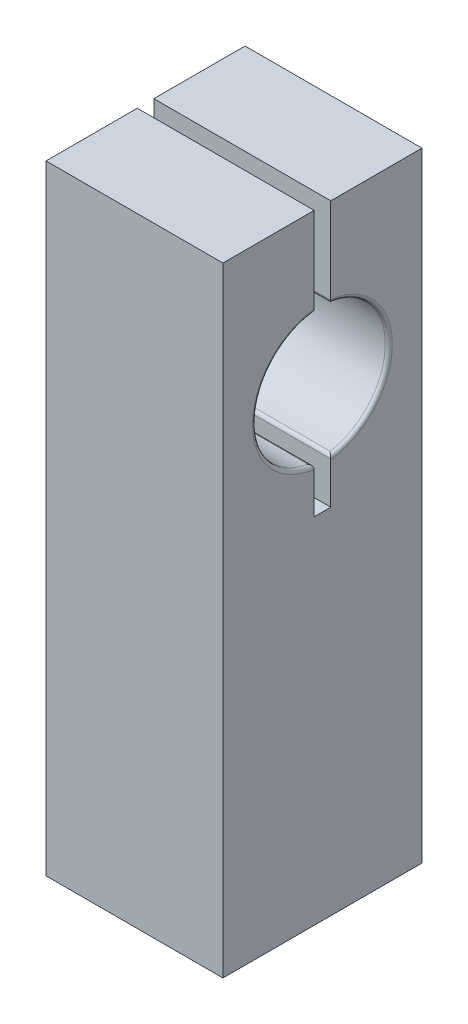
ISO-10303-21;
HEADER;
FILE_DESCRIPTION(('STEP AP214'),'2;1');
FILE_NAME('part.step','',(''),(''),'','','');
FILE_SCHEMA(('AUTOMOTIVE_DESIGN { 1 0 10303 214 1 1 1 1 }'));
ENDSEC;
DATA;
#1=APPLICATION_CONTEXT('core data for automotive mechanical design processes');
#2=APPLICATION_PROTOCOL_DEFINITION('international standard','automotive_design',2000,#1);
#3=PRODUCT_CONTEXT('',#1,'mechanical');
#4=PRODUCT('Part','Part','',(#3));
#5=PRODUCT_RELATED_PRODUCT_CATEGORY('part','',(#4));
#6=PRODUCT_DEFINITION_FORMATION('','',#4);
#7=PRODUCT_DEFINITION_CONTEXT('part definition',#1,'design');
#8=PRODUCT_DEFINITION('design','',#6,#7);
#9=PRODUCT_DEFINITION_SHAPE('','',#8);
#10=(LENGTH_UNIT() NAMED_UNIT(*) SI_UNIT(.MILLI.,.METRE.));
#11=(NAMED_UNIT(*) PLANE_ANGLE_UNIT() SI_UNIT($,.RADIAN.));
#12=(NAMED_UNIT(*) SI_UNIT($,.STERADIAN.) SOLID_ANGLE_UNIT());
#13=UNCERTAINTY_MEASURE_WITH_UNIT(LENGTH_MEASURE(1.E-05),#10,'distance_accuracy_value','');
#14=(GEOMETRIC_REPRESENTATION_CONTEXT(3) GLOBAL_UNCERTAINTY_ASSIGNED_CONTEXT((#13)) GLOBAL_UNIT_ASSIGNED_CONTEXT((#10,
#11,#12)) REPRESENTATION_CONTEXT('',''));
#15=CARTESIAN_POINT('',(0.,0.,0.));
#16=DIRECTION('',(0.,0.,1.));
#17=DIRECTION('',(1.,0.,0.));
#18=AXIS2_PLACEMENT_3D('',#15,#16,#17);
#19=CARTESIAN_POINT('',(0.,88.9,0.));
#20=DIRECTION('',(0.,-1.,0.));
#21=DIRECTION('',(0.,0.,-1.));
#22=AXIS2_PLACEMENT_3D('',#19,#20,#21);
#23=PLANE('',#22);
#24=DIRECTION('',(0.,0.,-1.));
#25=VECTOR('',#24,1.);
#26=CARTESIAN_POINT('',(25.4,88.9,0.));
#27=LINE('',#26,#25);
#28=CARTESIAN_POINT('',(25.4,88.9,0.));
#29=VERTEX_POINT('',#28);
#30=CARTESIAN_POINT('',(25.4,88.9,-13.096875));
#31=VERTEX_POINT('',#30);
#32=EDGE_CURVE('E231',#29,#31,#27,.T.);
#33=ORIENTED_EDGE('',*,*,#32,.T.);
#34=DIRECTION('',(1.,0.,0.));
#35=VECTOR('',#34,1.);
#36=CARTESIAN_POINT('',(-0.00100000000000447,88.9,-13.096875));
#37=LINE('',#36,#35);
#38=CARTESIAN_POINT('',(0.,88.9,-13.096875));
#39=VERTEX_POINT('',#38);
#40=EDGE_CURVE('E194',#39,#31,#37,.T.);
#41=ORIENTED_EDGE('',*,*,#40,.F.);
#42=DIRECTION('',(0.,0.,1.));
#43=VECTOR('',#42,1.);
#44=CARTESIAN_POINT('',(0.,88.9,0.));
#45=LINE('',#44,#43);
#46=CARTESIAN_POINT('',(0.,88.9,0.));
#47=VERTEX_POINT('',#46);
#48=EDGE_CURVE('E228',#39,#47,#45,.T.);
#49=ORIENTED_EDGE('',*,*,#48,.T.);
#50=DIRECTION('',(1.,0.,0.));
#51=VECTOR('',#50,1.);
#52=CARTESIAN_POINT('',(0.,88.9,0.));
#53=LINE('',#52,#51);
#54=EDGE_CURVE('E227',#47,#29,#53,.T.);
#55=ORIENTED_EDGE('',*,*,#54,.T.);
#56=EDGE_LOOP('',(#33,#41,#49,#55));
#57=FACE_BOUND('',#56,.T.);
#58=ADVANCED_FACE('F35',(#57),#23,.F.);
#59=CARTESIAN_POINT('',(0.,88.9,0.));
#60=DIRECTION('',(1.,0.,0.));
#61=DIRECTION('',(0.,0.,-1.));
#62=AXIS2_PLACEMENT_3D('',#59,#60,#61);
#63=PLANE('',#62);
#64=DIRECTION('',(0.,-1.,0.));
#65=VECTOR('',#64,1.);
#66=CARTESIAN_POINT('',(0.,50.8,-15.478125));
#67=LINE('',#66,#65);
#68=CARTESIAN_POINT('',(0.,56.7128967527246,-15.478125));
#69=VERTEX_POINT('',#68);
#70=CARTESIAN_POINT('',(0.,50.8,-15.478125));
#71=VERTEX_POINT('',#70);
#72=EDGE_CURVE('E205',#69,#71,#67,.T.);
#73=ORIENTED_EDGE('',*,*,#72,.F.);
#74=CARTESIAN_POINT('',(0.,66.675,-14.2875));
#75=DIRECTION('',(1.,0.,0.));
#76=DIRECTION('',(0.,0.,-1.));
#77=AXIS2_PLACEMENT_3D('',#74,#75,#76);
#78=CIRCLE('',#77,10.033);
#79=CARTESIAN_POINT('',(0.,76.6371032472754,-15.478125));
#80=VERTEX_POINT('',#79);
#81=EDGE_CURVE('E391',#69,#80,#78,.T.);
#82=ORIENTED_EDGE('',*,*,#81,.T.);
#83=DIRECTION('',(0.,-1.,0.));
#84=VECTOR('',#83,1.);
#85=CARTESIAN_POINT('',(0.,88.9,-15.478125));
#86=LINE('',#85,#84);
#87=CARTESIAN_POINT('',(0.,88.9,-15.478125));
#88=VERTEX_POINT('',#87);
#89=EDGE_CURVE('E201',#88,#80,#86,.T.);
#90=ORIENTED_EDGE('',*,*,#89,.F.);
#91=CARTESIAN_POINT('',(0.,88.9,-28.575));
#92=VERTEX_POINT('',#91);
#93=EDGE_CURVE('E224',#92,#88,#45,.T.);
#94=ORIENTED_EDGE('',*,*,#93,.F.);
#95=DIRECTION('',(0.,-1.,0.));
#96=VECTOR('',#95,1.);
#97=CARTESIAN_POINT('',(0.,88.9,-28.575));
#98=LINE('',#97,#96);
#99=CARTESIAN_POINT('',(0.,0.,-28.575));
#100=VERTEX_POINT('',#99);
#101=EDGE_CURVE('E236',#92,#100,#98,.T.);
#102=ORIENTED_EDGE('',*,*,#101,.T.);
#103=DIRECTION('',(0.,0.,1.));
#104=VECTOR('',#103,1.);
#105=CARTESIAN_POINT('',(0.,0.,0.));
#106=LINE('',#105,#104);
#107=CARTESIAN_POINT('',(0.,0.,0.));
#108=VERTEX_POINT('',#107);
#109=EDGE_CURVE('E193',#100,#108,#106,.T.);
#110=ORIENTED_EDGE('',*,*,#109,.T.);
#111=DIRECTION('',(0.,-1.,0.));
#112=VECTOR('',#111,1.);
#113=CARTESIAN_POINT('',(0.,88.9,0.));
#114=LINE('',#113,#112);
#115=EDGE_CURVE('E253',#47,#108,#114,.T.);
#116=ORIENTED_EDGE('',*,*,#115,.F.);
#117=ORIENTED_EDGE('',*,*,#48,.F.);
#118=DIRECTION('',(0.,1.,0.));
#119=VECTOR('',#118,1.);
#120=CARTESIAN_POINT('',(0.,76.1252929642088,-13.096875));
#121=LINE('',#120,#119);
#122=CARTESIAN_POINT('',(0.,76.6371032472754,-13.096875));
#123=VERTEX_POINT('',#122);
#124=EDGE_CURVE('E200',#123,#39,#121,.T.);
#125=ORIENTED_EDGE('',*,*,#124,.F.);
#126=CARTESIAN_POINT('',(0.,66.675,-14.2875));
#127=DIRECTION('',(1.,0.,0.));
#128=DIRECTION('',(0.,0.,-1.));
#129=AXIS2_PLACEMENT_3D('',#126,#127,#128);
#130=CIRCLE('',#129,10.033);
#131=CARTESIAN_POINT('',(0.,56.7128967527246,-13.096875));
#132=VERTEX_POINT('',#131);
#133=EDGE_CURVE('E199',#123,#132,#130,.T.);
#134=ORIENTED_EDGE('',*,*,#133,.T.);
#135=DIRECTION('',(0.,1.,0.));
#136=VECTOR('',#135,1.);
#137=CARTESIAN_POINT('',(0.,57.2247070357912,-13.096875));
#138=LINE('',#137,#136);
#139=CARTESIAN_POINT('',(0.,50.8,-13.096875));
#140=VERTEX_POINT('',#139);
#141=EDGE_CURVE('E178',#140,#132,#138,.T.);
#142=ORIENTED_EDGE('',*,*,#141,.F.);
#143=DIRECTION('',(0.,0.,1.));
#144=VECTOR('',#143,1.);
#145=CARTESIAN_POINT('',(0.,50.8,-13.096875));
#146=LINE('',#145,#144);
#147=EDGE_CURVE('E189',#71,#140,#146,.T.);
#148=ORIENTED_EDGE('',*,*,#147,.F.);
#149=EDGE_LOOP('',(#73,#82,#90,#94,#102,#110,#116,#117,#125,#134,#142,#148));
#150=FACE_BOUND('',#149,.T.);
#151=ADVANCED_FACE('F196',(#150),#63,.F.);
#152=CARTESIAN_POINT('',(0.,88.9,0.));
#153=DIRECTION('',(0.,0.,-1.));
#154=DIRECTION('',(-1.,0.,0.));
#155=AXIS2_PLACEMENT_3D('',#152,#153,#154);
#156=PLANE('',#155);
#157=DIRECTION('',(1.,0.,0.));
#158=VECTOR('',#157,1.);
#159=CARTESIAN_POINT('',(0.,0.,0.));
#160=LINE('',#159,#158);
#161=CARTESIAN_POINT('',(25.4,0.,0.));
#162=VERTEX_POINT('',#161);
#163=EDGE_CURVE('E239',#108,#162,#160,.T.);
#164=ORIENTED_EDGE('',*,*,#163,.T.);
#165=DIRECTION('',(0.,-1.,0.));
#166=VECTOR('',#165,1.);
#167=CARTESIAN_POINT('',(25.4,88.9,0.));
#168=LINE('',#167,#166);
#169=EDGE_CURVE('E250',#29,#162,#168,.T.);
#170=ORIENTED_EDGE('',*,*,#169,.F.);
#171=ORIENTED_EDGE('',*,*,#54,.F.);
#172=ORIENTED_EDGE('',*,*,#115,.T.);
#173=EDGE_LOOP('',(#164,#170,#171,#172));
#174=FACE_BOUND('',#173,.T.);
#175=ADVANCED_FACE('F421',(#174),#156,.F.);
#176=CARTESIAN_POINT('',(25.4,88.9,0.));
#177=DIRECTION('',(-1.,0.,0.));
#178=DIRECTION('',(0.,0.,1.));
#179=AXIS2_PLACEMENT_3D('',#176,#177,#178);
#180=PLANE('',#179);
#181=DIRECTION('',(0.,-1.,0.));
#182=VECTOR('',#181,1.);
#183=CARTESIAN_POINT('',(25.4,57.2247070357912,-13.096875));
#184=LINE('',#183,#182);
#185=CARTESIAN_POINT('',(25.4,56.7128967527246,-13.096875));
#186=VERTEX_POINT('',#185);
#187=CARTESIAN_POINT('',(25.4,50.8,-13.096875));
#188=VERTEX_POINT('',#187);
#189=EDGE_CURVE('E180',#186,#188,#184,.T.);
#190=ORIENTED_EDGE('',*,*,#189,.F.);
#191=CARTESIAN_POINT('',(25.4,66.675,-14.2875));
#192=DIRECTION('',(-1.,0.,0.));
#193=DIRECTION('',(0.,0.,1.));
#194=AXIS2_PLACEMENT_3D('',#191,#192,#193);
#195=CIRCLE('',#194,10.033);
#196=CARTESIAN_POINT('',(25.4,76.6371032472754,-13.096875));
#197=VERTEX_POINT('',#196);
#198=EDGE_CURVE('E11',#186,#197,#195,.T.);
#199=ORIENTED_EDGE('',*,*,#198,.T.);
#200=DIRECTION('',(0.,-1.,0.));
#201=VECTOR('',#200,1.);
#202=CARTESIAN_POINT('',(25.4,76.1252929642088,-13.096875));
#203=LINE('',#202,#201);
#204=EDGE_CURVE('E185',#31,#197,#203,.T.);
#205=ORIENTED_EDGE('',*,*,#204,.F.);
#206=ORIENTED_EDGE('',*,*,#32,.F.);
#207=ORIENTED_EDGE('',*,*,#169,.T.);
#208=DIRECTION('',(0.,0.,-1.));
#209=VECTOR('',#208,1.);
#210=CARTESIAN_POINT('',(25.4,0.,0.));
#211=LINE('',#210,#209);
#212=CARTESIAN_POINT('',(25.4,0.,-28.575));
#213=VERTEX_POINT('',#212);
#214=EDGE_CURVE('E241',#162,#213,#211,.T.);
#215=ORIENTED_EDGE('',*,*,#214,.T.);
#216=DIRECTION('',(0.,-1.,0.));
#217=VECTOR('',#216,1.);
#218=CARTESIAN_POINT('',(25.4,88.9,-28.575));
#219=LINE('',#218,#217);
#220=CARTESIAN_POINT('',(25.4,88.9,-28.575));
#221=VERTEX_POINT('',#220);
#222=EDGE_CURVE('E247',#221,#213,#219,.T.);
#223=ORIENTED_EDGE('',*,*,#222,.F.);
#224=CARTESIAN_POINT('',(25.4,88.9,-15.478125));
#225=VERTEX_POINT('',#224);
#226=EDGE_CURVE('E230',#225,#221,#27,.T.);
#227=ORIENTED_EDGE('',*,*,#226,.F.);
#228=DIRECTION('',(0.,1.,0.));
#229=VECTOR('',#228,1.);
#230=CARTESIAN_POINT('',(25.4,88.9,-15.478125));
#231=LINE('',#230,#229);
#232=CARTESIAN_POINT('',(25.4,76.6371032472754,-15.478125));
#233=VERTEX_POINT('',#232);
#234=EDGE_CURVE('E215',#233,#225,#231,.T.);
#235=ORIENTED_EDGE('',*,*,#234,.F.);
#236=CARTESIAN_POINT('',(25.4,66.675,-14.2875));
#237=DIRECTION('',(-1.,0.,0.));
#238=DIRECTION('',(0.,0.,1.));
#239=AXIS2_PLACEMENT_3D('',#236,#237,#238);
#240=CIRCLE('',#239,10.033);
#241=CARTESIAN_POINT('',(25.4,56.7128967527246,-15.478125));
#242=VERTEX_POINT('',#241);
#243=EDGE_CURVE('E48',#233,#242,#240,.T.);
#244=ORIENTED_EDGE('',*,*,#243,.T.);
#245=DIRECTION('',(0.,1.,0.));
#246=VECTOR('',#245,1.);
#247=CARTESIAN_POINT('',(25.4,50.8,-15.478125));
#248=LINE('',#247,#246);
#249=CARTESIAN_POINT('',(25.4,50.8,-15.478125));
#250=VERTEX_POINT('',#249);
#251=EDGE_CURVE('E212',#250,#242,#248,.T.);
#252=ORIENTED_EDGE('',*,*,#251,.F.);
#253=DIRECTION('',(0.,0.,-1.));
#254=VECTOR('',#253,1.);
#255=CARTESIAN_POINT('',(25.4,50.8,-13.096875));
#256=LINE('',#255,#254);
#257=EDGE_CURVE('E210',#188,#250,#256,.T.);
#258=ORIENTED_EDGE('',*,*,#257,.F.);
#259=EDGE_LOOP('',(#190,#199,#205,#206,#207,#215,#223,#227,#235,#244,#252,#258));
#260=FACE_BOUND('',#259,.T.);
#261=ADVANCED_FACE('F424',(#260),#180,.F.);
#262=CARTESIAN_POINT('',(0.,88.9,-28.575));
#263=DIRECTION('',(0.,0.,1.));
#264=DIRECTION('',(1.,0.,0.));
#265=AXIS2_PLACEMENT_3D('',#262,#263,#264);
#266=PLANE('',#265);
#267=DIRECTION('',(-1.,0.,0.));
#268=VECTOR('',#267,1.);
#269=CARTESIAN_POINT('',(0.,0.,-28.575));
#270=LINE('',#269,#268);
#271=EDGE_CURVE('E243',#213,#100,#270,.T.);
#272=ORIENTED_EDGE('',*,*,#271,.T.);
#273=ORIENTED_EDGE('',*,*,#101,.F.);
#274=DIRECTION('',(-1.,0.,0.));
#275=VECTOR('',#274,1.);
#276=CARTESIAN_POINT('',(0.,88.9,-28.575));
#277=LINE('',#276,#275);
#278=EDGE_CURVE('E234',#221,#92,#277,.T.);
#279=ORIENTED_EDGE('',*,*,#278,.F.);
#280=ORIENTED_EDGE('',*,*,#222,.T.);
#281=EDGE_LOOP('',(#272,#273,#279,#280));
#282=FACE_BOUND('',#281,.T.);
#283=ADVANCED_FACE('F428',(#282),#266,.F.);
#284=ORIENTED_EDGE('',*,*,#93,.T.);
#285=DIRECTION('',(1.,0.,0.));
#286=VECTOR('',#285,1.);
#287=CARTESIAN_POINT('',(-0.00100000000000447,88.9,-15.478125));
#288=LINE('',#287,#286);
#289=EDGE_CURVE('E220',#88,#225,#288,.T.);
#290=ORIENTED_EDGE('',*,*,#289,.T.);
#291=ORIENTED_EDGE('',*,*,#226,.T.);
#292=ORIENTED_EDGE('',*,*,#278,.T.);
#293=EDGE_LOOP('',(#284,#290,#291,#292));
#294=FACE_BOUND('',#293,.T.);
#295=ADVANCED_FACE('F402',(#294),#23,.F.);
#296=CARTESIAN_POINT('',(0.,0.,0.));
#297=DIRECTION('',(0.,-1.,0.));
#298=DIRECTION('',(0.,0.,-1.));
#299=AXIS2_PLACEMENT_3D('',#296,#297,#298);
#300=PLANE('',#299);
#301=ORIENTED_EDGE('',*,*,#109,.F.);
#302=ORIENTED_EDGE('',*,*,#271,.F.);
#303=ORIENTED_EDGE('',*,*,#214,.F.);
#304=ORIENTED_EDGE('',*,*,#163,.F.);
#305=EDGE_LOOP('',(#301,#302,#303,#304));
#306=FACE_BOUND('',#305,.T.);
#307=ADVANCED_FACE('F401',(#306),#300,.T.);
#308=CARTESIAN_POINT('',(-0.00100000000000447,57.2247070357912,-13.096875));
#309=DIRECTION('',(0.,0.,1.));
#310=DIRECTION('',(0.,-1.,0.));
#311=AXIS2_PLACEMENT_3D('',#308,#309,#310);
#312=PLANE('',#311);
#313=ORIENTED_EDGE('',*,*,#141,.T.);
#314=CARTESIAN_POINT('',(0.,56.7128967527246,-13.096875));
#315=CARTESIAN_POINT('',(1.14996261619972E-06,56.7252841924022,-13.096875));
#316=CARTESIAN_POINT('',(0.00044612115966896,56.7376396227099,-13.096875));
#317=CARTESIAN_POINT('',(0.00222370590099619,56.7622864628984,-13.096875));
#318=CARTESIAN_POINT('',(0.00355631932377667,56.774577872788,-13.096875));
#319=CARTESIAN_POINT('',(0.0053327538594997,56.7868372733164,-13.096875));
#320=B_SPLINE_CURVE_WITH_KNOTS('',3,(#314,#315,#316,#317,#318,#319),.UNSPECIFIED.,.F.,.F.,(4,2,
4),(0.,0.0370903210700019,0.0741806370633519),.UNSPECIFIED.);
#321=CARTESIAN_POINT('',(0.00533275385949965,56.7868372733164,-13.096875));
#322=VERTEX_POINT('',#321);
#323=EDGE_CURVE('E56',#132,#322,#320,.T.);
#324=ORIENTED_EDGE('',*,*,#323,.T.);
#325=DIRECTION('',(1.,0.,0.));
#326=VECTOR('',#325,1.);
#327=CARTESIAN_POINT('',(-0.00100000000000447,56.7868372733164,-13.096875));
#328=LINE('',#327,#326);
#329=CARTESIAN_POINT('',(25.3946672461405,56.7868372733164,-13.096875));
#330=VERTEX_POINT('',#329);
#331=EDGE_CURVE('E60',#322,#330,#328,.T.);
#332=ORIENTED_EDGE('',*,*,#331,.T.);
#333=CARTESIAN_POINT('',(25.3946672461405,56.7868372733164,-13.096875));
#334=CARTESIAN_POINT('',(25.3964436806762,56.774577872788,-13.096875));
#335=CARTESIAN_POINT('',(25.397776294099,56.7622864628984,-13.096875));
#336=CARTESIAN_POINT('',(25.3995538788403,56.7376396227099,-13.096875));
#337=CARTESIAN_POINT('',(25.3999988500374,56.7252841924022,-13.096875));
#338=CARTESIAN_POINT('',(25.4,56.7128967527246,-13.096875));
#339=B_SPLINE_CURVE_WITH_KNOTS('',3,(#333,#334,#335,#336,#337,#338),.UNSPECIFIED.,.F.,.F.,(4,2,
4),(0.,0.0370903159933498,0.0741806370633519),.UNSPECIFIED.);
#340=EDGE_CURVE('E393',#330,#186,#339,.T.);
#341=ORIENTED_EDGE('',*,*,#340,.T.);
#342=ORIENTED_EDGE('',*,*,#189,.T.);
#343=DIRECTION('',(1.,0.,0.));
#344=VECTOR('',#343,1.);
#345=CARTESIAN_POINT('',(-0.00100000000000447,50.8,-13.096875));
#346=LINE('',#345,#344);
#347=EDGE_CURVE('E174',#140,#188,#346,.T.);
#348=ORIENTED_EDGE('',*,*,#347,.F.);
#349=EDGE_LOOP('',(#313,#324,#332,#341,#342,#348));
#350=FACE_BOUND('',#349,.T.);
#351=ADVANCED_FACE('F176',(#350),#312,.F.);
#352=CARTESIAN_POINT('',(-0.00100000000000447,66.675,-14.2875));
#353=DIRECTION('',(1.,0.,0.));
#354=DIRECTION('',(0.,0.,-1.));
#355=AXIS2_PLACEMENT_3D('',#352,#353,#354);
#356=CYLINDRICAL_SURFACE('',#355,9.525);
#357=CARTESIAN_POINT('',(0.508,66.675,-14.2875));
#358=DIRECTION('',(1.,0.,0.));
#359=DIRECTION('',(0.,0.,-1.));
#360=AXIS2_PLACEMENT_3D('',#357,#358,#359);
#361=CIRCLE('',#360,9.525);
#362=CARTESIAN_POINT('',(0.508,57.2875037404902,-12.6748813291139));
#363=VERTEX_POINT('',#362);
#364=CARTESIAN_POINT('',(0.508,76.0624962595098,-12.6748813291139));
#365=VERTEX_POINT('',#364);
#366=EDGE_CURVE('E260',#363,#365,#361,.F.);
#367=ORIENTED_EDGE('',*,*,#366,.T.);
#368=DIRECTION('',(1.,0.,0.));
#369=VECTOR('',#368,1.);
#370=CARTESIAN_POINT('',(-0.00100000000000425,76.0624962595098,-12.6748813291139));
#371=LINE('',#370,#369);
#372=CARTESIAN_POINT('',(24.892,76.0624962595098,-12.6748813291139));
#373=VERTEX_POINT('',#372);
#374=EDGE_CURVE('E262',#365,#373,#371,.T.);
#375=ORIENTED_EDGE('',*,*,#374,.T.);
#376=CARTESIAN_POINT('',(24.892,66.675,-14.2875));
#377=DIRECTION('',(-1.,0.,0.));
#378=DIRECTION('',(0.,0.,1.));
#379=AXIS2_PLACEMENT_3D('',#376,#377,#378);
#380=CIRCLE('',#379,9.525);
#381=CARTESIAN_POINT('',(24.892,57.2875037404902,-12.6748813291139));
#382=VERTEX_POINT('',#381);
#383=EDGE_CURVE('E256',#373,#382,#380,.F.);
#384=ORIENTED_EDGE('',*,*,#383,.T.);
#385=DIRECTION('',(1.,0.,0.));
#386=VECTOR('',#385,1.);
#387=CARTESIAN_POINT('',(-0.00100000000000425,57.2875037404902,-12.6748813291139));
#388=LINE('',#387,#386);
#389=EDGE_CURVE('E258',#382,#363,#388,.F.);
#390=ORIENTED_EDGE('',*,*,#389,.T.);
#391=EDGE_LOOP('',(#367,#375,#384,#390));
#392=FACE_BOUND('',#391,.T.);
#393=ADVANCED_FACE('F284',(#392),#356,.F.);
#394=CARTESIAN_POINT('',(-0.00100000000000447,76.1252929642088,-13.096875));
#395=DIRECTION('',(0.,0.,1.));
#396=DIRECTION('',(1.,0.,0.));
#397=AXIS2_PLACEMENT_3D('',#394,#395,#396);
#398=PLANE('',#397);
#399=DIRECTION('',(1.,0.,0.));
#400=VECTOR('',#399,1.);
#401=CARTESIAN_POINT('',(-0.00100000000000447,76.5631627266836,-13.096875));
#402=LINE('',#401,#400);
#403=CARTESIAN_POINT('',(25.3946672461405,76.5631627266836,-13.096875));
#404=VERTEX_POINT('',#403);
#405=CARTESIAN_POINT('',(0.00533275385949965,76.5631627266836,-13.096875));
#406=VERTEX_POINT('',#405);
#407=EDGE_CURVE('E272',#404,#406,#402,.F.);
#408=ORIENTED_EDGE('',*,*,#407,.T.);
#409=CARTESIAN_POINT('',(0.00533275385949965,76.5631627266836,-13.096875));
#410=CARTESIAN_POINT('',(0.00355631932377767,76.575422127212,-13.096875));
#411=CARTESIAN_POINT('',(0.0022237059009972,76.5877135371016,-13.096875));
#412=CARTESIAN_POINT('',(0.000446121159668389,76.6123603772901,-13.096875));
#413=CARTESIAN_POINT('',(1.14996261354934E-06,76.6247158075978,-13.096875));
#414=CARTESIAN_POINT('',(0.,76.6371032472754,-13.096875));
#415=B_SPLINE_CURVE_WITH_KNOTS('',3,(#409,#410,#411,#412,#413,#414),.UNSPECIFIED.,.F.,.F.,(4,2,
4),(0.,0.0370903159933569,0.0741806370633452),.UNSPECIFIED.);
#416=EDGE_CURVE('E289',#406,#123,#415,.T.);
#417=ORIENTED_EDGE('',*,*,#416,.T.);
#418=ORIENTED_EDGE('',*,*,#124,.T.);
#419=ORIENTED_EDGE('',*,*,#40,.T.);
#420=ORIENTED_EDGE('',*,*,#204,.T.);
#421=CARTESIAN_POINT('',(25.4,76.6371032472754,-13.096875));
#422=CARTESIAN_POINT('',(25.3999988500374,76.6247158075978,-13.096875));
#423=CARTESIAN_POINT('',(25.3995538788403,76.6123603772901,-13.096875));
#424=CARTESIAN_POINT('',(25.397776294099,76.5877135371016,-13.096875));
#425=CARTESIAN_POINT('',(25.3964436806762,76.575422127212,-13.096875));
#426=CARTESIAN_POINT('',(25.3946672461405,76.5631627266836,-13.096875));
#427=B_SPLINE_CURVE_WITH_KNOTS('',3,(#421,#422,#423,#424,#425,#426),.UNSPECIFIED.,.F.,.F.,(4,2,
4),(0.,0.0370903210699881,0.0741806370633448),.UNSPECIFIED.);
#428=EDGE_CURVE('E265',#197,#404,#427,.T.);
#429=ORIENTED_EDGE('',*,*,#428,.T.);
#430=EDGE_LOOP('',(#408,#417,#418,#419,#420,#429));
#431=FACE_BOUND('',#430,.T.);
#432=ADVANCED_FACE('F278',(#431),#398,.F.);
#433=CARTESIAN_POINT('',(-0.00100000000000447,88.9,-15.478125));
#434=DIRECTION('',(0.,0.,-1.));
#435=DIRECTION('',(-1.,0.,0.));
#436=AXIS2_PLACEMENT_3D('',#433,#434,#435);
#437=PLANE('',#436);
#438=ORIENTED_EDGE('',*,*,#89,.T.);
#439=CARTESIAN_POINT('',(0.,76.6371032472754,-15.478125));
#440=CARTESIAN_POINT('',(1.14996261669661E-06,76.6247158075978,-15.478125));
#441=CARTESIAN_POINT('',(0.000446121159669457,76.6123603772901,-15.478125));
#442=CARTESIAN_POINT('',(0.0022237059009962,76.5877135371016,-15.478125));
#443=CARTESIAN_POINT('',(0.00355631932377667,76.575422127212,-15.478125));
#444=CARTESIAN_POINT('',(0.00533275385949971,76.5631627266836,-15.478125));
#445=B_SPLINE_CURVE_WITH_KNOTS('',3,(#439,#440,#441,#442,#443,#444),.UNSPECIFIED.,.F.,.F.,(4,2,
4),(0.,0.037090321069988,0.0741806370633449),.UNSPECIFIED.);
#446=CARTESIAN_POINT('',(0.00533275385949965,76.5631627266836,-15.478125));
#447=VERTEX_POINT('',#446);
#448=EDGE_CURVE('E355',#80,#447,#445,.T.);
#449=ORIENTED_EDGE('',*,*,#448,.T.);
#450=DIRECTION('',(1.,0.,0.));
#451=VECTOR('',#450,1.);
#452=CARTESIAN_POINT('',(-0.00100000000000447,76.5631627266836,-15.478125));
#453=LINE('',#452,#451);
#454=CARTESIAN_POINT('',(25.3946672461405,76.5631627266836,-15.478125));
#455=VERTEX_POINT('',#454);
#456=EDGE_CURVE('E361',#447,#455,#453,.T.);
#457=ORIENTED_EDGE('',*,*,#456,.T.);
#458=CARTESIAN_POINT('',(25.3946672461405,76.5631627266836,-15.478125));
#459=CARTESIAN_POINT('',(25.3964436806762,76.575422127212,-15.478125));
#460=CARTESIAN_POINT('',(25.397776294099,76.5877135371016,-15.478125));
#461=CARTESIAN_POINT('',(25.3995538788403,76.6123603772901,-15.478125));
#462=CARTESIAN_POINT('',(25.3999988500374,76.6247158075978,-15.478125));
#463=CARTESIAN_POINT('',(25.4,76.6371032472754,-15.478125));
#464=B_SPLINE_CURVE_WITH_KNOTS('',3,(#458,#459,#460,#461,#462,#463),.UNSPECIFIED.,.F.,.F.,(4,2,
4),(0.,0.0370903159933571,0.0741806370633453),.UNSPECIFIED.);
#465=EDGE_CURVE('E294',#455,#233,#464,.T.);
#466=ORIENTED_EDGE('',*,*,#465,.T.);
#467=ORIENTED_EDGE('',*,*,#234,.T.);
#468=ORIENTED_EDGE('',*,*,#289,.F.);
#469=EDGE_LOOP('',(#438,#449,#457,#466,#467,#468));
#470=FACE_BOUND('',#469,.T.);
#471=ADVANCED_FACE('F283',(#470),#437,.F.);
#472=CARTESIAN_POINT('',(-0.00100000000000447,66.675,-14.2875));
#473=DIRECTION('',(1.,0.,0.));
#474=DIRECTION('',(0.,0.,-1.));
#475=AXIS2_PLACEMENT_3D('',#472,#473,#474);
#476=CYLINDRICAL_SURFACE('',#475,9.525);
#477=CARTESIAN_POINT('',(24.892,66.675,-14.2875));
#478=DIRECTION('',(-1.,0.,0.));
#479=DIRECTION('',(0.,0.,1.));
#480=AXIS2_PLACEMENT_3D('',#477,#478,#479);
#481=CIRCLE('',#480,9.525);
#482=CARTESIAN_POINT('',(24.892,57.2875037404902,-15.9001186708861));
#483=VERTEX_POINT('',#482);
#484=CARTESIAN_POINT('',(24.892,76.0624962595098,-15.9001186708861));
#485=VERTEX_POINT('',#484);
#486=EDGE_CURVE('E360',#483,#485,#481,.F.);
#487=ORIENTED_EDGE('',*,*,#486,.T.);
#488=DIRECTION('',(1.,0.,0.));
#489=VECTOR('',#488,1.);
#490=CARTESIAN_POINT('',(-0.00100000000000469,76.0624962595098,-15.9001186708861));
#491=LINE('',#490,#489);
#492=CARTESIAN_POINT('',(0.508,76.0624962595098,-15.9001186708861));
#493=VERTEX_POINT('',#492);
#494=EDGE_CURVE('E367',#485,#493,#491,.F.);
#495=ORIENTED_EDGE('',*,*,#494,.T.);
#496=CARTESIAN_POINT('',(0.508,66.675,-14.2875));
#497=DIRECTION('',(1.,0.,0.));
#498=DIRECTION('',(0.,0.,-1.));
#499=AXIS2_PLACEMENT_3D('',#496,#497,#498);
#500=CIRCLE('',#499,9.525);
#501=CARTESIAN_POINT('',(0.508,57.2875037404902,-15.9001186708861));
#502=VERTEX_POINT('',#501);
#503=EDGE_CURVE('E365',#493,#502,#500,.F.);
#504=ORIENTED_EDGE('',*,*,#503,.T.);
#505=DIRECTION('',(1.,0.,0.));
#506=VECTOR('',#505,1.);
#507=CARTESIAN_POINT('',(-0.00100000000000469,57.2875037404902,-15.9001186708861));
#508=LINE('',#507,#506);
#509=EDGE_CURVE('E363',#502,#483,#508,.T.);
#510=ORIENTED_EDGE('',*,*,#509,.T.);
#511=EDGE_LOOP('',(#487,#495,#504,#510));
#512=FACE_BOUND('',#511,.T.);
#513=ADVANCED_FACE('F381',(#512),#476,.F.);
#514=CARTESIAN_POINT('',(-0.00100000000000447,50.8,-15.478125));
#515=DIRECTION('',(0.,0.,-1.));
#516=DIRECTION('',(0.,1.,0.));
#517=AXIS2_PLACEMENT_3D('',#514,#515,#516);
#518=PLANE('',#517);
#519=DIRECTION('',(1.,0.,0.));
#520=VECTOR('',#519,1.);
#521=CARTESIAN_POINT('',(-0.00100000000000447,56.7868372733164,-15.478125));
#522=LINE('',#521,#520);
#523=CARTESIAN_POINT('',(25.3946672461405,56.7868372733164,-15.478125));
#524=VERTEX_POINT('',#523);
#525=CARTESIAN_POINT('',(0.00533275385949965,56.7868372733164,-15.478125));
#526=VERTEX_POINT('',#525);
#527=EDGE_CURVE('E376',#524,#526,#522,.F.);
#528=ORIENTED_EDGE('',*,*,#527,.T.);
#529=CARTESIAN_POINT('',(0.00533275385949965,56.7868372733164,-15.478125));
#530=CARTESIAN_POINT('',(0.00355631932377768,56.774577872788,-15.478125));
#531=CARTESIAN_POINT('',(0.00222370590099721,56.7622864628984,-15.478125));
#532=CARTESIAN_POINT('',(0.000446121159667903,56.7376396227099,-15.478125));
#533=CARTESIAN_POINT('',(1.14996261306221E-06,56.7252841924022,-15.478125));
#534=CARTESIAN_POINT('',(0.,56.7128967527246,-15.478125));
#535=B_SPLINE_CURVE_WITH_KNOTS('',3,(#529,#530,#531,#532,#533,#534),.UNSPECIFIED.,.F.,.F.,(4,2,
4),(0.,0.03709031599335,0.0741806370633521),.UNSPECIFIED.);
#536=EDGE_CURVE('E385',#526,#69,#535,.T.);
#537=ORIENTED_EDGE('',*,*,#536,.T.);
#538=ORIENTED_EDGE('',*,*,#72,.T.);
#539=DIRECTION('',(1.,0.,0.));
#540=VECTOR('',#539,1.);
#541=CARTESIAN_POINT('',(-0.00100000000000447,50.8,-15.478125));
#542=LINE('',#541,#540);
#543=EDGE_CURVE('E184',#71,#250,#542,.T.);
#544=ORIENTED_EDGE('',*,*,#543,.T.);
#545=ORIENTED_EDGE('',*,*,#251,.T.);
#546=CARTESIAN_POINT('',(25.4,56.7128967527246,-15.478125));
#547=CARTESIAN_POINT('',(25.3999988500374,56.7252841924022,-15.478125));
#548=CARTESIAN_POINT('',(25.3995538788403,56.7376396227099,-15.478125));
#549=CARTESIAN_POINT('',(25.397776294099,56.7622864628984,-15.478125));
#550=CARTESIAN_POINT('',(25.3964436806762,56.774577872788,-15.478125));
#551=CARTESIAN_POINT('',(25.3946672461405,56.7868372733164,-15.478125));
#552=B_SPLINE_CURVE_WITH_KNOTS('',3,(#546,#547,#548,#549,#550,#551),.UNSPECIFIED.,.F.,.F.,(4,2,
4),(0.,0.0370903210700018,0.074180637063352),.UNSPECIFIED.);
#553=EDGE_CURVE('E370',#242,#524,#552,.T.);
#554=ORIENTED_EDGE('',*,*,#553,.T.);
#555=EDGE_LOOP('',(#528,#537,#538,#544,#545,#554));
#556=FACE_BOUND('',#555,.T.);
#557=ADVANCED_FACE('F377',(#556),#518,.F.);
#558=CARTESIAN_POINT('',(-0.00100000000000447,50.8,-13.096875));
#559=DIRECTION('',(0.,-1.,0.));
#560=DIRECTION('',(0.,0.,-1.));
#561=AXIS2_PLACEMENT_3D('',#558,#559,#560);
#562=PLANE('',#561);
#563=ORIENTED_EDGE('',*,*,#147,.T.);
#564=ORIENTED_EDGE('',*,*,#347,.T.);
#565=ORIENTED_EDGE('',*,*,#257,.T.);
#566=ORIENTED_EDGE('',*,*,#543,.F.);
#567=EDGE_LOOP('',(#563,#564,#565,#566));
#568=FACE_BOUND('',#567,.T.);
#569=ADVANCED_FACE('F190',(#568),#562,.F.);
#570=CARTESIAN_POINT('',(-0.00100000000000424,56.7868372733164,-12.588875));
#571=DIRECTION('',(1.,0.,0.));
#572=DIRECTION('',(0.,0.,-1.));
#573=AXIS2_PLACEMENT_3D('',#570,#571,#572);
#574=CYLINDRICAL_SURFACE('',#573,0.508);
#575=CARTESIAN_POINT('',(25.3946672461405,56.7868372733164,-13.096875));
#576=CARTESIAN_POINT('',(25.3911015475547,56.8116439665479,-13.0969038811554));
#577=CARTESIAN_POINT('',(25.3857154460939,56.8360708123264,-13.09506166129));
#578=CARTESIAN_POINT('',(25.3719466599581,56.8833344542222,-13.0881826435984));
#579=CARTESIAN_POINT('',(25.3635953248372,56.9061850060757,-13.083178855213));
#580=CARTESIAN_POINT('',(25.3444936657585,56.9498839905497,-13.0705369986853));
#581=CARTESIAN_POINT('',(25.3337561782881,56.9707423127065,-13.0629129109756));
#582=CARTESIAN_POINT('',(25.3103728237801,57.0104524089243,-13.045526784301));
#583=CARTESIAN_POINT('',(25.297721688054,57.0292983903125,-13.0357588081803));
#584=CARTESIAN_POINT('',(25.2634747207145,57.0748606772431,-13.0085810038754));
#585=CARTESIAN_POINT('',(25.2408384314312,57.1000712860076,-12.9899557182609));
#586=CARTESIAN_POINT('',(25.1932779567739,57.1455934961412,-12.9498212748055));
#587=CARTESIAN_POINT('',(25.1683473073296,57.1658906326421,-12.9283038852185));
#588=CARTESIAN_POINT('',(25.1034949649269,57.2113781993987,-12.8713196801459));
#589=CARTESIAN_POINT('',(25.0626112781759,57.2334893794852,-12.8344886021591));
#590=CARTESIAN_POINT('',(24.9795387891436,57.2676716553008,-12.7580201617759));
#591=CARTESIAN_POINT('',(24.9373527582274,57.2797627264863,-12.7183885544446));
#592=CARTESIAN_POINT('',(24.8941523588085,57.2871454688284,-12.6769476632079));
#593=CARTESIAN_POINT('',(24.8930761529273,57.287326200664,-12.6759147442274));
#594=CARTESIAN_POINT('',(24.892,57.2875037404902,-12.6748813291139));
#595=B_SPLINE_CURVE_WITH_KNOTS('',3,(#575,#576,#577,#578,#579,#580,#581,#582,#583,#584,#585,
#586,#587,#588,#589,#590,#591,#592,#593,#594),.UNSPECIFIED.,.F.,.F.,(4,2,2,2,2,2,2,2,2,4),(0.,
0.0748788759851044,0.148988587906351,0.222708877765263,0.296635959689259,0.411978836745014,
0.527657253465892,0.704444582926444,0.880878626713736,0.885386408305007),.UNSPECIFIED.);
#596=EDGE_CURVE('E325',#330,#382,#595,.T.);
#597=ORIENTED_EDGE('',*,*,#596,.F.);
#598=ORIENTED_EDGE('',*,*,#331,.F.);
#599=CARTESIAN_POINT('',(0.00533275385949965,56.7868372733164,-13.096875));
#600=CARTESIAN_POINT('',(0.00889845244533188,56.8116439665479,-13.0969038811554));
#601=CARTESIAN_POINT('',(0.0142845539061456,56.8360708123264,-13.09506166129));
#602=CARTESIAN_POINT('',(0.0280533400419223,56.8833344542222,-13.0881826435984));
#603=CARTESIAN_POINT('',(0.0364046751627482,56.9061850060757,-13.083178855213));
#604=CARTESIAN_POINT('',(0.0555063342414705,56.9498839905497,-13.0705369986853));
#605=CARTESIAN_POINT('',(0.0662438217119209,56.9707423127065,-13.0629129109756));
#606=CARTESIAN_POINT('',(0.0896271762198867,57.0104524089243,-13.045526784301));
#607=CARTESIAN_POINT('',(0.102278311946032,57.0292983903125,-13.0357588081803));
#608=CARTESIAN_POINT('',(0.136525279285509,57.0748606772431,-13.0085810038754));
#609=CARTESIAN_POINT('',(0.159161568568843,57.1000712860076,-12.9899557182609));
#610=CARTESIAN_POINT('',(0.20672204322612,57.1455934961412,-12.9498212748055));
#611=CARTESIAN_POINT('',(0.231652692670413,57.1658906326421,-12.9283038852185));
#612=CARTESIAN_POINT('',(0.296505035073148,57.2113781993987,-12.8713196801459));
#613=CARTESIAN_POINT('',(0.337388721824206,57.2334893794852,-12.8344886021592));
#614=CARTESIAN_POINT('',(0.420461210856351,57.2676716553008,-12.7580201617758));
#615=CARTESIAN_POINT('',(0.462647241772255,57.2797627264863,-12.7183885544442));
#616=CARTESIAN_POINT('',(0.505847641191514,57.2871454688284,-12.6769476632079));
#617=CARTESIAN_POINT('',(0.506923847072733,57.287326200664,-12.6759147442274));
#618=CARTESIAN_POINT('',(0.508,57.2875037404902,-12.6748813291139));
#619=B_SPLINE_CURVE_WITH_KNOTS('',3,(#599,#600,#601,#602,#603,#604,#605,#606,#607,#608,#609,
#610,#611,#612,#613,#614,#615,#616,#617,#618),.UNSPECIFIED.,.F.,.F.,(4,2,2,2,2,2,2,2,2,4),(0.,
0.074878875985104,0.148988587906351,0.222708877765261,0.296635959689254,0.411978836745007,
0.527657253465876,0.704444582926431,0.880878626713744,0.88538640830501),.UNSPECIFIED.);
#620=EDGE_CURVE('E319',#363,#322,#619,.F.);
#621=ORIENTED_EDGE('',*,*,#620,.F.);
#622=ORIENTED_EDGE('',*,*,#389,.F.);
#623=EDGE_LOOP('',(#597,#598,#621,#622));
#624=FACE_BOUND('',#623,.T.);
#625=ADVANCED_FACE('F304',(#624),#574,.T.);
#626=CARTESIAN_POINT('',(0.508,66.675,-14.2875));
#627=DIRECTION('',(1.,0.,0.));
#628=DIRECTION('',(0.,0.,-1.));
#629=AXIS2_PLACEMENT_3D('',#626,#627,#628);
#630=TOROIDAL_SURFACE('',#629,10.033,0.508);
#631=ORIENTED_EDGE('',*,*,#133,.F.);
#632=ORIENTED_EDGE('',*,*,#416,.F.);
#633=CARTESIAN_POINT('',(0.00533275385949965,76.5631627266836,-13.096875));
#634=CARTESIAN_POINT('',(0.00889845244533455,76.5383560334521,-13.0969038811554));
#635=CARTESIAN_POINT('',(0.0142845539061472,76.5139291876736,-13.09506166129));
#636=CARTESIAN_POINT('',(0.0280533400419208,76.4666655457778,-13.0881826435984));
#637=CARTESIAN_POINT('',(0.0364046751627446,76.4438149939243,-13.083178855213));
#638=CARTESIAN_POINT('',(0.0555063342414663,76.4001160094503,-13.0705369986853));
#639=CARTESIAN_POINT('',(0.066243821711918,76.3792576872935,-13.0629129109756));
#640=CARTESIAN_POINT('',(0.0896271762198837,76.3395475910757,-13.045526784301));
#641=CARTESIAN_POINT('',(0.102278311946028,76.3207016096875,-13.0357588081803));
#642=CARTESIAN_POINT('',(0.136525279285506,76.2751393227569,-13.0085810038754));
#643=CARTESIAN_POINT('',(0.159161568568842,76.2499287139924,-12.9899557182609));
#644=CARTESIAN_POINT('',(0.206722043226115,76.2044065038588,-12.9498212748055));
#645=CARTESIAN_POINT('',(0.231652692670402,76.1841093673579,-12.9283038852185));
#646=CARTESIAN_POINT('',(0.296505035073166,76.1386218006013,-12.8713196801459));
#647=CARTESIAN_POINT('',(0.337388721824284,76.1165106205148,-12.8344886021592));
#648=CARTESIAN_POINT('',(0.420461210856283,76.0823283446992,-12.7580201617757));
#649=CARTESIAN_POINT('',(0.462647241771979,76.0702372735136,-12.718388554444));
#650=CARTESIAN_POINT('',(0.505847641191497,76.0628545311716,-12.6769476632079));
#651=CARTESIAN_POINT('',(0.506923847072725,76.062673799336,-12.6759147442274));
#652=CARTESIAN_POINT('',(0.508,76.0624962595098,-12.6748813291139));
#653=B_SPLINE_CURVE_WITH_KNOTS('',3,(#633,#634,#635,#636,#637,#638,#639,#640,#641,#642,#643,
#644,#645,#646,#647,#648,#649,#650,#651,#652),.UNSPECIFIED.,.F.,.F.,(4,2,2,2,2,2,2,2,2,4),(0.,
0.0748788759851041,0.148988587906349,0.222708877765247,0.29663595968925,0.41197883674501,
0.527657253465876,0.704444582926436,0.88087862671374,0.885386408305012),.UNSPECIFIED.);
#654=EDGE_CURVE('E310',#365,#406,#653,.F.);
#655=ORIENTED_EDGE('',*,*,#654,.F.);
#656=ORIENTED_EDGE('',*,*,#366,.F.);
#657=ORIENTED_EDGE('',*,*,#620,.T.);
#658=ORIENTED_EDGE('',*,*,#323,.F.);
#659=EDGE_LOOP('',(#631,#632,#655,#656,#657,#658));
#660=FACE_BOUND('',#659,.T.);
#661=ADVANCED_FACE('F300',(#660),#630,.T.);
#662=CARTESIAN_POINT('',(24.892,66.675,-14.2875));
#663=DIRECTION('',(-1.,0.,0.));
#664=DIRECTION('',(0.,0.,1.));
#665=AXIS2_PLACEMENT_3D('',#662,#663,#664);
#666=TOROIDAL_SURFACE('',#665,10.033,0.508);
#667=ORIENTED_EDGE('',*,*,#596,.T.);
#668=ORIENTED_EDGE('',*,*,#383,.F.);
#669=CARTESIAN_POINT('',(25.3946672461405,76.5631627266836,-13.096875));
#670=CARTESIAN_POINT('',(25.3911015475547,76.5383560334521,-13.0969038811554));
#671=CARTESIAN_POINT('',(25.3857154460938,76.5139291876736,-13.09506166129));
#672=CARTESIAN_POINT('',(25.3719466599581,76.4666655457778,-13.0881826435984));
#673=CARTESIAN_POINT('',(25.3635953248373,76.4438149939243,-13.083178855213));
#674=CARTESIAN_POINT('',(25.3444936657585,76.4001160094503,-13.0705369986853));
#675=CARTESIAN_POINT('',(25.3337561782881,76.3792576872935,-13.0629129109756));
#676=CARTESIAN_POINT('',(25.3103728237801,76.3395475910757,-13.045526784301));
#677=CARTESIAN_POINT('',(25.297721688054,76.3207016096875,-13.0357588081803));
#678=CARTESIAN_POINT('',(25.2634747207145,76.2751393227569,-13.0085810038754));
#679=CARTESIAN_POINT('',(25.2408384314312,76.2499287139924,-12.9899557182609));
#680=CARTESIAN_POINT('',(25.1932779567739,76.2044065038588,-12.9498212748055));
#681=CARTESIAN_POINT('',(25.1683473073296,76.1841093673579,-12.9283038852185));
#682=CARTESIAN_POINT('',(25.1034949649269,76.1386218006013,-12.8713196801459));
#683=CARTESIAN_POINT('',(25.0626112781759,76.1165106205147,-12.834488602159));
#684=CARTESIAN_POINT('',(24.9795387891435,76.0823283446992,-12.7580201617759));
#685=CARTESIAN_POINT('',(24.9373527582272,76.0702372735138,-12.7183885544448));
#686=CARTESIAN_POINT('',(24.8941523588085,76.0628545311716,-12.6769476632079));
#687=CARTESIAN_POINT('',(24.8930761529273,76.062673799336,-12.6759147442274));
#688=CARTESIAN_POINT('',(24.892,76.0624962595098,-12.6748813291139));
#689=B_SPLINE_CURVE_WITH_KNOTS('',3,(#669,#670,#671,#672,#673,#674,#675,#676,#677,#678,#679,
#680,#681,#682,#683,#684,#685,#686,#687,#688),.UNSPECIFIED.,.F.,.F.,(4,2,2,2,2,2,2,2,2,4),(0.,
0.0748788759851044,0.148988587906349,0.222708877765248,0.29663595968925,0.411978836745011,
0.527657253465881,0.704444582926433,0.880878626713742,0.885386408305007),.UNSPECIFIED.);
#690=EDGE_CURVE('E409',#404,#373,#689,.T.);
#691=ORIENTED_EDGE('',*,*,#690,.F.);
#692=ORIENTED_EDGE('',*,*,#428,.F.);
#693=ORIENTED_EDGE('',*,*,#198,.F.);
#694=ORIENTED_EDGE('',*,*,#340,.F.);
#695=EDGE_LOOP('',(#667,#668,#691,#692,#693,#694));
#696=FACE_BOUND('',#695,.T.);
#697=ADVANCED_FACE('F274',(#696),#666,.T.);
#698=CARTESIAN_POINT('',(-0.00100000000000424,76.5631627266836,-12.588875));
#699=DIRECTION('',(1.,0.,0.));
#700=DIRECTION('',(0.,0.,-1.));
#701=AXIS2_PLACEMENT_3D('',#698,#699,#700);
#702=CYLINDRICAL_SURFACE('',#701,0.508);
#703=ORIENTED_EDGE('',*,*,#654,.T.);
#704=ORIENTED_EDGE('',*,*,#407,.F.);
#705=ORIENTED_EDGE('',*,*,#690,.T.);
#706=ORIENTED_EDGE('',*,*,#374,.F.);
#707=EDGE_LOOP('',(#703,#704,#705,#706));
#708=FACE_BOUND('',#707,.T.);
#709=ADVANCED_FACE('F413',(#708),#702,.T.);
#710=CARTESIAN_POINT('',(-0.0010000000000047,56.7868372733164,-15.986125));
#711=DIRECTION('',(1.,0.,0.));
#712=DIRECTION('',(0.,0.,-1.));
#713=AXIS2_PLACEMENT_3D('',#710,#711,#712);
#714=CYLINDRICAL_SURFACE('',#713,0.508);
#715=CARTESIAN_POINT('',(25.3946672461405,56.7868372733164,-15.478125));
#716=CARTESIAN_POINT('',(25.3911015475547,56.8116439665479,-15.4780961188446));
#717=CARTESIAN_POINT('',(25.3857154460939,56.8360708123264,-15.47993833871));
#718=CARTESIAN_POINT('',(25.3719466599581,56.8833344542222,-15.4868173564016));
#719=CARTESIAN_POINT('',(25.3635953248372,56.9061850060757,-15.491821144787));
#720=CARTESIAN_POINT('',(25.3444936657585,56.9498839905497,-15.5044630013147));
#721=CARTESIAN_POINT('',(25.3337561782881,56.9707423127065,-15.5120870890244));
#722=CARTESIAN_POINT('',(25.3103728237801,57.0104524089243,-15.529473215699));
#723=CARTESIAN_POINT('',(25.297721688054,57.0292983903125,-15.5392411918197));
#724=CARTESIAN_POINT('',(25.2634747207145,57.0748606772431,-15.5664189961246));
#725=CARTESIAN_POINT('',(25.2408384314312,57.1000712860076,-15.5850442817391));
#726=CARTESIAN_POINT('',(25.1932779567739,57.1455934961412,-15.6251787251945));
#727=CARTESIAN_POINT('',(25.1683473073296,57.1658906326421,-15.6466961147815));
#728=CARTESIAN_POINT('',(25.1034949649269,57.2113781993987,-15.7036803198541));
#729=CARTESIAN_POINT('',(25.0626112781759,57.2334893794852,-15.7405113978409));
#730=CARTESIAN_POINT('',(24.9795387891436,57.2676716553008,-15.8169798382241));
#731=CARTESIAN_POINT('',(24.9373527582274,57.2797627264863,-15.8566114455554));
#732=CARTESIAN_POINT('',(24.8941523588085,57.2871454688284,-15.8980523367921));
#733=CARTESIAN_POINT('',(24.8930761529273,57.287326200664,-15.8990852557726));
#734=CARTESIAN_POINT('',(24.892,57.2875037404902,-15.9001186708861));
#735=B_SPLINE_CURVE_WITH_KNOTS('',3,(#715,#716,#717,#718,#719,#720,#721,#722,#723,#724,#725,
#726,#727,#728,#729,#730,#731,#732,#733,#734),.UNSPECIFIED.,.F.,.F.,(4,2,2,2,2,2,2,2,2,4),(0.,
0.0748788759851035,0.14898858790635,0.222708877765262,0.296635959689253,0.411978836745007,
0.527657253465877,0.704444582926436,0.880878626713731,0.885386408305004),.UNSPECIFIED.);
#736=EDGE_CURVE('E479',#483,#524,#735,.F.);
#737=ORIENTED_EDGE('',*,*,#736,.F.);
#738=ORIENTED_EDGE('',*,*,#509,.F.);
#739=CARTESIAN_POINT('',(0.00533275385949965,56.7868372733164,-15.478125));
#740=CARTESIAN_POINT('',(0.00889845244533167,56.8116439665479,-15.4780961188446));
#741=CARTESIAN_POINT('',(0.0142845539061455,56.8360708123264,-15.47993833871));
#742=CARTESIAN_POINT('',(0.0280533400419226,56.8833344542222,-15.4868173564016));
#743=CARTESIAN_POINT('',(0.0364046751627482,56.9061850060757,-15.491821144787));
#744=CARTESIAN_POINT('',(0.0555063342414705,56.9498839905497,-15.5044630013147));
#745=CARTESIAN_POINT('',(0.0662438217119214,56.9707423127065,-15.5120870890244));
#746=CARTESIAN_POINT('',(0.0896271762198879,57.0104524089243,-15.529473215699));
#747=CARTESIAN_POINT('',(0.102278311946034,57.0292983903125,-15.5392411918197));
#748=CARTESIAN_POINT('',(0.136525279285505,57.0748606772431,-15.5664189961246));
#749=CARTESIAN_POINT('',(0.159161568568828,57.1000712860076,-15.5850442817391));
#750=CARTESIAN_POINT('',(0.206722043226133,57.1455934961412,-15.6251787251945));
#751=CARTESIAN_POINT('',(0.231652692670465,57.1658906326421,-15.6466961147814));
#752=CARTESIAN_POINT('',(0.29650503507307,57.2113781993987,-15.7036803198542));
#753=CARTESIAN_POINT('',(0.337388721823837,57.2334893794853,-15.7405113978412));
#754=CARTESIAN_POINT('',(0.420461210856726,57.2676716553008,-15.8169798382238));
#755=CARTESIAN_POINT('',(0.462647241773659,57.2797627264861,-15.8566114455543));
#756=CARTESIAN_POINT('',(0.505847641191585,57.2871454688284,-15.898052336792));
#757=CARTESIAN_POINT('',(0.506923847072769,57.287326200664,-15.8990852557726));
#758=CARTESIAN_POINT('',(0.508,57.2875037404902,-15.9001186708861));
#759=B_SPLINE_CURVE_WITH_KNOTS('',3,(#739,#740,#741,#742,#743,#744,#745,#746,#747,#748,#749,
#750,#751,#752,#753,#754,#755,#756,#757,#758),.UNSPECIFIED.,.F.,.F.,(4,2,2,2,2,2,2,2,2,4),(0.,
0.0748788759851108,0.14898858790635,0.222708877765254,0.296635959689253,0.411978836745005,
0.527657253465875,0.704444582926439,0.880878626713745,0.88538640830501),.UNSPECIFIED.);
#760=EDGE_CURVE('E40',#526,#502,#759,.T.);
#761=ORIENTED_EDGE('',*,*,#760,.F.);
#762=ORIENTED_EDGE('',*,*,#527,.F.);
#763=EDGE_LOOP('',(#737,#738,#761,#762));
#764=FACE_BOUND('',#763,.T.);
#765=ADVANCED_FACE('F37',(#764),#714,.T.);
#766=CARTESIAN_POINT('',(0.508,66.675,-14.2875));
#767=DIRECTION('',(1.,0.,0.));
#768=DIRECTION('',(0.,0.,-1.));
#769=AXIS2_PLACEMENT_3D('',#766,#767,#768);
#770=TOROIDAL_SURFACE('',#769,10.033,0.508);
#771=ORIENTED_EDGE('',*,*,#760,.T.);
#772=ORIENTED_EDGE('',*,*,#503,.F.);
#773=CARTESIAN_POINT('',(0.00533275385949965,76.5631627266836,-15.478125));
#774=CARTESIAN_POINT('',(0.00889845244533472,76.5383560334521,-15.4780961188446));
#775=CARTESIAN_POINT('',(0.0142845539061473,76.5139291876736,-15.47993833871));
#776=CARTESIAN_POINT('',(0.0280533400419208,76.4666655457778,-15.4868173564016));
#777=CARTESIAN_POINT('',(0.0364046751627445,76.4438149939243,-15.491821144787));
#778=CARTESIAN_POINT('',(0.0555063342414665,76.4001160094503,-15.5044630013147));
#779=CARTESIAN_POINT('',(0.0662438217119185,76.3792576872935,-15.5120870890244));
#780=CARTESIAN_POINT('',(0.0896271762198844,76.3395475910757,-15.529473215699));
#781=CARTESIAN_POINT('',(0.102278311946029,76.3207016096875,-15.5392411918197));
#782=CARTESIAN_POINT('',(0.136525279285505,76.2751393227569,-15.5664189961246));
#783=CARTESIAN_POINT('',(0.15916156856884,76.2499287139924,-15.5850442817391));
#784=CARTESIAN_POINT('',(0.206722043226117,76.2044065038588,-15.6251787251945));
#785=CARTESIAN_POINT('',(0.231652692670409,76.1841093673579,-15.6466961147815));
#786=CARTESIAN_POINT('',(0.296505035073163,76.1386218006013,-15.7036803198541));
#787=CARTESIAN_POINT('',(0.337388721824251,76.1165106205148,-15.7405113978408));
#788=CARTESIAN_POINT('',(0.42046121085632,76.0823283446992,-15.8169798382243));
#789=CARTESIAN_POINT('',(0.462647241772117,76.0702372735136,-15.8566114455559));
#790=CARTESIAN_POINT('',(0.505847641191506,76.0628545311716,-15.8980523367921));
#791=CARTESIAN_POINT('',(0.506923847072729,76.062673799336,-15.8990852557726));
#792=CARTESIAN_POINT('',(0.508,76.0624962595098,-15.9001186708861));
#793=B_SPLINE_CURVE_WITH_KNOTS('',3,(#773,#774,#775,#776,#777,#778,#779,#780,#781,#782,#783,
#784,#785,#786,#787,#788,#789,#790,#791,#792),.UNSPECIFIED.,.F.,.F.,(4,2,2,2,2,2,2,2,2,4),(0.,
0.0748788759851042,0.148988587906349,0.222708877765247,0.296635959689251,0.41197883674501,
0.527657253465879,0.704444582926444,0.880878626713745,0.885386408305012),.UNSPECIFIED.);
#794=EDGE_CURVE('E335',#447,#493,#793,.T.);
#795=ORIENTED_EDGE('',*,*,#794,.F.);
#796=ORIENTED_EDGE('',*,*,#448,.F.);
#797=ORIENTED_EDGE('',*,*,#81,.F.);
#798=ORIENTED_EDGE('',*,*,#536,.F.);
#799=EDGE_LOOP('',(#771,#772,#795,#796,#797,#798));
#800=FACE_BOUND('',#799,.T.);
#801=ADVANCED_FACE('F345',(#800),#770,.T.);
#802=CARTESIAN_POINT('',(24.892,66.675,-14.2875));
#803=DIRECTION('',(-1.,0.,0.));
#804=DIRECTION('',(0.,0.,1.));
#805=AXIS2_PLACEMENT_3D('',#802,#803,#804);
#806=TOROIDAL_SURFACE('',#805,10.033,0.508);
#807=ORIENTED_EDGE('',*,*,#243,.F.);
#808=ORIENTED_EDGE('',*,*,#465,.F.);
#809=CARTESIAN_POINT('',(25.3946672461405,76.5631627266836,-15.478125));
#810=CARTESIAN_POINT('',(25.3911015475547,76.5383560334521,-15.4780961188446));
#811=CARTESIAN_POINT('',(25.3857154460938,76.5139291876736,-15.47993833871));
#812=CARTESIAN_POINT('',(25.3719466599581,76.4666655457778,-15.4868173564016));
#813=CARTESIAN_POINT('',(25.3635953248373,76.4438149939243,-15.491821144787));
#814=CARTESIAN_POINT('',(25.3444936657585,76.4001160094502,-15.5044630013147));
#815=CARTESIAN_POINT('',(25.3337561782881,76.3792576872935,-15.5120870890244));
#816=CARTESIAN_POINT('',(25.3103728237801,76.3395475910757,-15.529473215699));
#817=CARTESIAN_POINT('',(25.297721688054,76.3207016096875,-15.5392411918197));
#818=CARTESIAN_POINT('',(25.2634747207145,76.2751393227569,-15.5664189961246));
#819=CARTESIAN_POINT('',(25.2408384314311,76.2499287139924,-15.5850442817391));
#820=CARTESIAN_POINT('',(25.1932779567739,76.2044065038588,-15.6251787251945));
#821=CARTESIAN_POINT('',(25.1683473073296,76.1841093673579,-15.6466961147815));
#822=CARTESIAN_POINT('',(25.1034949649268,76.1386218006013,-15.703680319854));
#823=CARTESIAN_POINT('',(25.0626112781754,76.1165106205149,-15.7405113978405));
#824=CARTESIAN_POINT('',(24.979538789144,76.0823283446991,-15.8169798382246));
#825=CARTESIAN_POINT('',(24.9373527582291,76.0702372735134,-15.8566114455571));
#826=CARTESIAN_POINT('',(24.8941523588086,76.0628545311716,-15.8980523367922));
#827=CARTESIAN_POINT('',(24.8930761529273,76.062673799336,-15.8990852557726));
#828=CARTESIAN_POINT('',(24.892,76.0624962595098,-15.9001186708861));
#829=B_SPLINE_CURVE_WITH_KNOTS('',3,(#809,#810,#811,#812,#813,#814,#815,#816,#817,#818,#819,
#820,#821,#822,#823,#824,#825,#826,#827,#828),.UNSPECIFIED.,.F.,.F.,(4,2,2,2,2,2,2,2,2,4),(0.,
0.0748788759851039,0.148988587906348,0.222708877765264,0.29663595968925,0.411978836745,
0.527657253465878,0.704444582926428,0.880878626713731,0.885386408305005),.UNSPECIFIED.);
#830=EDGE_CURVE('E329',#485,#455,#829,.F.);
#831=ORIENTED_EDGE('',*,*,#830,.F.);
#832=ORIENTED_EDGE('',*,*,#486,.F.);
#833=ORIENTED_EDGE('',*,*,#736,.T.);
#834=ORIENTED_EDGE('',*,*,#553,.F.);
#835=EDGE_LOOP('',(#807,#808,#831,#832,#833,#834));
#836=FACE_BOUND('',#835,.T.);
#837=ADVANCED_FACE('F339',(#836),#806,.T.);
#838=CARTESIAN_POINT('',(-0.0010000000000047,76.5631627266836,-15.986125));
#839=DIRECTION('',(1.,0.,0.));
#840=DIRECTION('',(0.,0.,-1.));
#841=AXIS2_PLACEMENT_3D('',#838,#839,#840);
#842=CYLINDRICAL_SURFACE('',#841,0.508);
#843=ORIENTED_EDGE('',*,*,#794,.T.);
#844=ORIENTED_EDGE('',*,*,#494,.F.);
#845=ORIENTED_EDGE('',*,*,#830,.T.);
#846=ORIENTED_EDGE('',*,*,#456,.F.);
#847=EDGE_LOOP('',(#843,#844,#845,#846));
#848=FACE_BOUND('',#847,.T.);
#849=ADVANCED_FACE('F341',(#848),#842,.T.);
#850=CLOSED_SHELL('',(#58,#151,#175,#261,#283,#295,#307,#351,#393,#432,#471,#513,#557,#569,#625,
#661,#697,#709,#765,#801,#837,#849));
#851=MANIFOLD_SOLID_BREP('B2',#850);
#852=ADVANCED_BREP_SHAPE_REPRESENTATION('',(#18,#851),#14);
#853=SHAPE_DEFINITION_REPRESENTATION(#9,#852);
ENDSEC;
END-ISO-10303-21;
